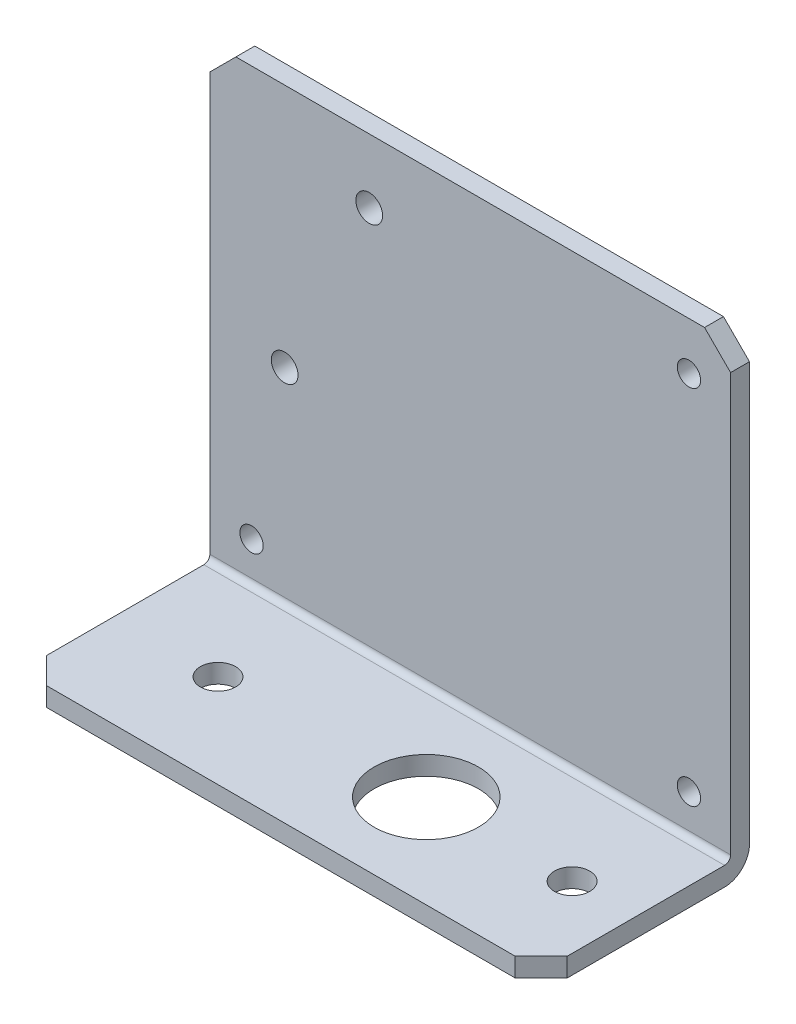
ISO-10303-21;
HEADER;
FILE_DESCRIPTION(('STEP AP214'),'2;1');
FILE_NAME('part.step','',(''),(''),'','','');
FILE_SCHEMA(('AUTOMOTIVE_DESIGN { 1 0 10303 214 1 1 1 1 }'));
ENDSEC;
DATA;
#1=APPLICATION_CONTEXT('core data for automotive mechanical design processes');
#2=APPLICATION_PROTOCOL_DEFINITION('international standard','automotive_design',2000,#1);
#3=PRODUCT_CONTEXT('',#1,'mechanical');
#4=PRODUCT('Part','Part','',(#3));
#5=PRODUCT_RELATED_PRODUCT_CATEGORY('part','',(#4));
#6=PRODUCT_DEFINITION_FORMATION('','',#4);
#7=PRODUCT_DEFINITION_CONTEXT('part definition',#1,'design');
#8=PRODUCT_DEFINITION('design','',#6,#7);
#9=PRODUCT_DEFINITION_SHAPE('','',#8);
#10=(LENGTH_UNIT() NAMED_UNIT(*) SI_UNIT(.MILLI.,.METRE.));
#11=(NAMED_UNIT(*) PLANE_ANGLE_UNIT() SI_UNIT($,.RADIAN.));
#12=(NAMED_UNIT(*) SI_UNIT($,.STERADIAN.) SOLID_ANGLE_UNIT());
#13=UNCERTAINTY_MEASURE_WITH_UNIT(LENGTH_MEASURE(1.E-05),#10,'distance_accuracy_value','');
#14=(GEOMETRIC_REPRESENTATION_CONTEXT(3) GLOBAL_UNCERTAINTY_ASSIGNED_CONTEXT((#13)) GLOBAL_UNIT_ASSIGNED_CONTEXT((#10,
#11,#12)) REPRESENTATION_CONTEXT('',''));
#15=CARTESIAN_POINT('',(0.,0.,0.));
#16=DIRECTION('',(0.,0.,1.));
#17=DIRECTION('',(1.,0.,0.));
#18=AXIS2_PLACEMENT_3D('',#15,#16,#17);
#19=CARTESIAN_POINT('',(63.5,2.30378,0.));
#20=DIRECTION('',(0.,1.,0.));
#21=DIRECTION('',(0.,0.,1.));
#22=AXIS2_PLACEMENT_3D('',#19,#20,#21);
#23=PLANE('',#22);
#24=CARTESIAN_POINT('',(38.1,2.30378,-11.38682));
#25=DIRECTION('',(0.,1.,0.));
#26=DIRECTION('',(0.,0.,1.));
#27=AXIS2_PLACEMENT_3D('',#24,#25,#26);
#28=CIRCLE('',#27,6.3627);
#29=CARTESIAN_POINT('',(38.1,2.30378,-5.02412));
#30=VERTEX_POINT('',#29);
#31=EDGE_CURVE('E144',#30,#30,#28,.F.);
#32=ORIENTED_EDGE('',*,*,#31,.T.);
#33=EDGE_LOOP('',(#32));
#34=FACE_BOUND('',#33,.T.);
#35=CARTESIAN_POINT('',(55.88,2.30378,-11.38682));
#36=DIRECTION('',(0.,1.,0.));
#37=DIRECTION('',(0.,0.,1.));
#38=AXIS2_PLACEMENT_3D('',#35,#36,#37);
#39=CIRCLE('',#38,2.15265);
#40=CARTESIAN_POINT('',(55.88,2.30378,-9.23417));
#41=VERTEX_POINT('',#40);
#42=EDGE_CURVE('E147',#41,#41,#39,.F.);
#43=ORIENTED_EDGE('',*,*,#42,.T.);
#44=EDGE_LOOP('',(#43));
#45=FACE_BOUND('',#44,.T.);
#46=CARTESIAN_POINT('',(12.7,2.30378,-11.38682));
#47=DIRECTION('',(0.,1.,0.));
#48=DIRECTION('',(0.,0.,1.));
#49=AXIS2_PLACEMENT_3D('',#46,#47,#48);
#50=CIRCLE('',#49,2.15265);
#51=CARTESIAN_POINT('',(12.7,2.30378,-9.23417));
#52=VERTEX_POINT('',#51);
#53=EDGE_CURVE('E19',#52,#52,#50,.F.);
#54=ORIENTED_EDGE('',*,*,#53,.T.);
#55=EDGE_LOOP('',(#54));
#56=FACE_BOUND('',#55,.T.);
#57=DIRECTION('',(0.,0.,-1.));
#58=VECTOR('',#57,1.);
#59=CARTESIAN_POINT('',(63.5,2.30378,-23.09622));
#60=LINE('',#59,#58);
#61=CARTESIAN_POINT('',(63.5,2.30378,-22.35962));
#62=VERTEX_POINT('',#61);
#63=CARTESIAN_POINT('',(63.5,2.30378,-3.175));
#64=VERTEX_POINT('',#63);
#65=EDGE_CURVE('E146',#62,#64,#60,.F.);
#66=ORIENTED_EDGE('',*,*,#65,.F.);
#67=DIRECTION('',(-1.,0.,0.));
#68=VECTOR('',#67,1.);
#69=CARTESIAN_POINT('',(63.5,2.30378,-22.35962));
#70=LINE('',#69,#68);
#71=CARTESIAN_POINT('',(0.,2.30378,-22.35962));
#72=VERTEX_POINT('',#71);
#73=EDGE_CURVE('E128',#62,#72,#70,.T.);
#74=ORIENTED_EDGE('',*,*,#73,.T.);
#75=DIRECTION('',(0.,0.,-1.));
#76=VECTOR('',#75,1.);
#77=CARTESIAN_POINT('',(0.,2.30378,-22.35962));
#78=LINE('',#77,#76);
#79=CARTESIAN_POINT('',(0.,2.30378,-3.175));
#80=VERTEX_POINT('',#79);
#81=EDGE_CURVE('E298',#72,#80,#78,.F.);
#82=ORIENTED_EDGE('',*,*,#81,.T.);
#83=DIRECTION('',(0.707106781186548,0.,0.707106781186548));
#84=VECTOR('',#83,1.);
#85=CARTESIAN_POINT('',(0.,2.30378,-3.175));
#86=LINE('',#85,#84);
#87=CARTESIAN_POINT('',(3.175,2.30378,0.));
#88=VERTEX_POINT('',#87);
#89=EDGE_CURVE('E174',#88,#80,#86,.F.);
#90=ORIENTED_EDGE('',*,*,#89,.F.);
#91=DIRECTION('',(1.,0.,0.));
#92=VECTOR('',#91,1.);
#93=CARTESIAN_POINT('',(63.5,2.30378,0.));
#94=LINE('',#93,#92);
#95=CARTESIAN_POINT('',(60.325,2.30378,0.));
#96=VERTEX_POINT('',#95);
#97=EDGE_CURVE('E162',#96,#88,#94,.F.);
#98=ORIENTED_EDGE('',*,*,#97,.F.);
#99=DIRECTION('',(-0.707106781186548,0.,0.707106781186548));
#100=VECTOR('',#99,1.);
#101=CARTESIAN_POINT('',(60.325,2.30378,0.));
#102=LINE('',#101,#100);
#103=EDGE_CURVE('E176',#96,#64,#102,.F.);
#104=ORIENTED_EDGE('',*,*,#103,.T.);
#105=EDGE_LOOP('',(#66,#74,#82,#90,#98,#104));
#106=FACE_BOUND('',#105,.T.);
#107=ADVANCED_FACE('F16',(#34,#45,#56,#106),#23,.T.);
#108=CARTESIAN_POINT('',(60.325,0.,0.));
#109=DIRECTION('',(-0.707106781186548,0.,-0.707106781186548));
#110=DIRECTION('',(-0.707106781186548,0.,0.707106781186548));
#111=AXIS2_PLACEMENT_3D('',#108,#109,#110);
#112=PLANE('',#111);
#113=DIRECTION('',(0.,1.,0.));
#114=VECTOR('',#113,1.);
#115=CARTESIAN_POINT('',(63.5,3.04038,-3.175));
#116=LINE('',#115,#114);
#117=CARTESIAN_POINT('',(63.5,0.,-3.175));
#118=VERTEX_POINT('',#117);
#119=EDGE_CURVE('E301',#64,#118,#116,.F.);
#120=ORIENTED_EDGE('',*,*,#119,.F.);
#121=ORIENTED_EDGE('',*,*,#103,.F.);
#122=DIRECTION('',(0.,1.,0.));
#123=VECTOR('',#122,1.);
#124=CARTESIAN_POINT('',(60.325,0.,0.));
#125=LINE('',#124,#123);
#126=CARTESIAN_POINT('',(60.325,0.,0.));
#127=VERTEX_POINT('',#126);
#128=EDGE_CURVE('E152',#127,#96,#125,.T.);
#129=ORIENTED_EDGE('',*,*,#128,.F.);
#130=DIRECTION('',(0.707106781186548,0.,-0.707106781186547));
#131=VECTOR('',#130,1.);
#132=CARTESIAN_POINT('',(60.325,0.,0.));
#133=LINE('',#132,#131);
#134=EDGE_CURVE('E289',#127,#118,#133,.T.);
#135=ORIENTED_EDGE('',*,*,#134,.T.);
#136=EDGE_LOOP('',(#120,#121,#129,#135));
#137=FACE_BOUND('',#136,.T.);
#138=ADVANCED_FACE('F319',(#137),#112,.F.);
#139=CARTESIAN_POINT('',(0.,3.04038,-3.175));
#140=DIRECTION('',(-0.707106781186548,0.,0.707106781186548));
#141=DIRECTION('',(0.707106781186548,0.,0.707106781186548));
#142=AXIS2_PLACEMENT_3D('',#139,#140,#141);
#143=PLANE('',#142);
#144=ORIENTED_EDGE('',*,*,#89,.T.);
#145=DIRECTION('',(0.,1.,0.));
#146=VECTOR('',#145,1.);
#147=CARTESIAN_POINT('',(0.,3.04038,-3.175));
#148=LINE('',#147,#146);
#149=CARTESIAN_POINT('',(0.,0.,-3.175));
#150=VERTEX_POINT('',#149);
#151=EDGE_CURVE('E297',#80,#150,#148,.F.);
#152=ORIENTED_EDGE('',*,*,#151,.T.);
#153=DIRECTION('',(0.707106781186547,0.,0.707106781186548));
#154=VECTOR('',#153,1.);
#155=CARTESIAN_POINT('',(0.,0.,-3.175));
#156=LINE('',#155,#154);
#157=CARTESIAN_POINT('',(3.175,0.,0.));
#158=VERTEX_POINT('',#157);
#159=EDGE_CURVE('E171',#150,#158,#156,.T.);
#160=ORIENTED_EDGE('',*,*,#159,.T.);
#161=DIRECTION('',(0.,1.,0.));
#162=VECTOR('',#161,1.);
#163=CARTESIAN_POINT('',(3.175,0.,0.));
#164=LINE('',#163,#162);
#165=EDGE_CURVE('E156',#88,#158,#164,.F.);
#166=ORIENTED_EDGE('',*,*,#165,.F.);
#167=EDGE_LOOP('',(#144,#152,#160,#166));
#168=FACE_BOUND('',#167,.T.);
#169=ADVANCED_FACE('F330',(#168),#143,.T.);
#170=CARTESIAN_POINT('',(63.5,0.,0.));
#171=DIRECTION('',(0.,0.,1.));
#172=DIRECTION('',(1.,0.,0.));
#173=AXIS2_PLACEMENT_3D('',#170,#171,#172);
#174=PLANE('',#173);
#175=DIRECTION('',(1.,0.,0.));
#176=VECTOR('',#175,1.);
#177=CARTESIAN_POINT('',(63.5,0.,0.));
#178=LINE('',#177,#176);
#179=EDGE_CURVE('E143',#158,#127,#178,.T.);
#180=ORIENTED_EDGE('',*,*,#179,.T.);
#181=ORIENTED_EDGE('',*,*,#128,.T.);
#182=ORIENTED_EDGE('',*,*,#97,.T.);
#183=ORIENTED_EDGE('',*,*,#165,.T.);
#184=EDGE_LOOP('',(#180,#181,#182,#183));
#185=FACE_BOUND('',#184,.T.);
#186=ADVANCED_FACE('F328',(#185),#174,.T.);
#187=CARTESIAN_POINT('',(12.7,0.,-11.38682));
#188=DIRECTION('',(0.,1.,0.));
#189=DIRECTION('',(0.,0.,1.));
#190=AXIS2_PLACEMENT_3D('',#187,#188,#189);
#191=CYLINDRICAL_SURFACE('',#190,2.15265);
#192=CARTESIAN_POINT('',(12.7,0.,-11.38682));
#193=DIRECTION('',(0.,1.,0.));
#194=DIRECTION('',(0.,0.,1.));
#195=AXIS2_PLACEMENT_3D('',#192,#193,#194);
#196=CIRCLE('',#195,2.15265);
#197=CARTESIAN_POINT('',(12.7,0.,-9.23417));
#198=VERTEX_POINT('',#197);
#199=EDGE_CURVE('E140',#198,#198,#196,.F.);
#200=ORIENTED_EDGE('',*,*,#199,.T.);
#201=EDGE_LOOP('',(#200));
#202=FACE_BOUND('',#201,.T.);
#203=ORIENTED_EDGE('',*,*,#53,.F.);
#204=EDGE_LOOP('',(#203));
#205=FACE_BOUND('',#204,.T.);
#206=ADVANCED_FACE('F495',(#202,#205),#191,.F.);
#207=CARTESIAN_POINT('',(55.88,0.,-11.38682));
#208=DIRECTION('',(0.,1.,0.));
#209=DIRECTION('',(0.,0.,1.));
#210=AXIS2_PLACEMENT_3D('',#207,#208,#209);
#211=CYLINDRICAL_SURFACE('',#210,2.15265);
#212=CARTESIAN_POINT('',(55.88,0.,-11.38682));
#213=DIRECTION('',(0.,1.,0.));
#214=DIRECTION('',(0.,0.,1.));
#215=AXIS2_PLACEMENT_3D('',#212,#213,#214);
#216=CIRCLE('',#215,2.15265);
#217=CARTESIAN_POINT('',(55.88,0.,-9.23417));
#218=VERTEX_POINT('',#217);
#219=EDGE_CURVE('E134',#218,#218,#216,.F.);
#220=ORIENTED_EDGE('',*,*,#219,.T.);
#221=EDGE_LOOP('',(#220));
#222=FACE_BOUND('',#221,.T.);
#223=ORIENTED_EDGE('',*,*,#42,.F.);
#224=EDGE_LOOP('',(#223));
#225=FACE_BOUND('',#224,.T.);
#226=ADVANCED_FACE('F486',(#222,#225),#211,.F.);
#227=CARTESIAN_POINT('',(38.1,0.,-11.38682));
#228=DIRECTION('',(0.,1.,0.));
#229=DIRECTION('',(0.,0.,1.));
#230=AXIS2_PLACEMENT_3D('',#227,#228,#229);
#231=CYLINDRICAL_SURFACE('',#230,6.3627);
#232=CARTESIAN_POINT('',(38.1,0.,-11.38682));
#233=DIRECTION('',(0.,1.,0.));
#234=DIRECTION('',(0.,0.,1.));
#235=AXIS2_PLACEMENT_3D('',#232,#233,#234);
#236=CIRCLE('',#235,6.3627);
#237=CARTESIAN_POINT('',(38.1,0.,-5.02412));
#238=VERTEX_POINT('',#237);
#239=EDGE_CURVE('E130',#238,#238,#236,.F.);
#240=ORIENTED_EDGE('',*,*,#239,.T.);
#241=EDGE_LOOP('',(#240));
#242=FACE_BOUND('',#241,.T.);
#243=ORIENTED_EDGE('',*,*,#31,.F.);
#244=EDGE_LOOP('',(#243));
#245=FACE_BOUND('',#244,.T.);
#246=ADVANCED_FACE('F478',(#242,#245),#231,.F.);
#247=CARTESIAN_POINT('',(63.5,3.04038,-22.35962));
#248=DIRECTION('',(-1.,0.,0.));
#249=DIRECTION('',(0.,0.,1.));
#250=AXIS2_PLACEMENT_3D('',#247,#248,#249);
#251=CYLINDRICAL_SURFACE('',#250,0.7366);
#252=ORIENTED_EDGE('',*,*,#73,.F.);
#253=CARTESIAN_POINT('',(63.5,3.04038,-22.35962));
#254=DIRECTION('',(-1.,0.,0.));
#255=DIRECTION('',(0.,0.,1.));
#256=AXIS2_PLACEMENT_3D('',#253,#254,#255);
#257=CIRCLE('',#256,0.7366);
#258=CARTESIAN_POINT('',(63.5,3.04038,-23.09622));
#259=VERTEX_POINT('',#258);
#260=EDGE_CURVE('E120',#259,#62,#257,.T.);
#261=ORIENTED_EDGE('',*,*,#260,.F.);
#262=DIRECTION('',(1.,0.,0.));
#263=VECTOR('',#262,1.);
#264=CARTESIAN_POINT('',(63.5,3.04038,-23.09622));
#265=LINE('',#264,#263);
#266=CARTESIAN_POINT('',(0.,3.04038,-23.09622));
#267=VERTEX_POINT('',#266);
#268=EDGE_CURVE('E102',#267,#259,#265,.T.);
#269=ORIENTED_EDGE('',*,*,#268,.F.);
#270=CARTESIAN_POINT('',(0.,3.04038,-22.35962));
#271=DIRECTION('',(-1.,0.,0.));
#272=DIRECTION('',(0.,0.,1.));
#273=AXIS2_PLACEMENT_3D('',#270,#271,#272);
#274=CIRCLE('',#273,0.7366);
#275=EDGE_CURVE('E114',#72,#267,#274,.F.);
#276=ORIENTED_EDGE('',*,*,#275,.F.);
#277=EDGE_LOOP('',(#252,#261,#269,#276));
#278=FACE_BOUND('',#277,.T.);
#279=ADVANCED_FACE('F126',(#278),#251,.F.);
#280=CARTESIAN_POINT('',(63.5,0.,0.));
#281=DIRECTION('',(0.,1.,0.));
#282=DIRECTION('',(0.,0.,1.));
#283=AXIS2_PLACEMENT_3D('',#280,#281,#282);
#284=PLANE('',#283);
#285=ORIENTED_EDGE('',*,*,#239,.F.);
#286=EDGE_LOOP('',(#285));
#287=FACE_BOUND('',#286,.T.);
#288=ORIENTED_EDGE('',*,*,#219,.F.);
#289=EDGE_LOOP('',(#288));
#290=FACE_BOUND('',#289,.T.);
#291=ORIENTED_EDGE('',*,*,#199,.F.);
#292=EDGE_LOOP('',(#291));
#293=FACE_BOUND('',#292,.T.);
#294=ORIENTED_EDGE('',*,*,#159,.F.);
#295=DIRECTION('',(0.,0.,1.));
#296=VECTOR('',#295,1.);
#297=CARTESIAN_POINT('',(0.,0.,0.));
#298=LINE('',#297,#296);
#299=CARTESIAN_POINT('',(0.,0.,-22.35962));
#300=VERTEX_POINT('',#299);
#301=EDGE_CURVE('E288',#300,#150,#298,.T.);
#302=ORIENTED_EDGE('',*,*,#301,.F.);
#303=DIRECTION('',(-1.,0.,0.));
#304=VECTOR('',#303,1.);
#305=CARTESIAN_POINT('',(63.5,0.,-22.35962));
#306=LINE('',#305,#304);
#307=CARTESIAN_POINT('',(63.5,0.,-22.35962));
#308=VERTEX_POINT('',#307);
#309=EDGE_CURVE('E123',#308,#300,#306,.T.);
#310=ORIENTED_EDGE('',*,*,#309,.F.);
#311=DIRECTION('',(0.,0.,1.));
#312=VECTOR('',#311,1.);
#313=CARTESIAN_POINT('',(63.5,0.,0.));
#314=LINE('',#313,#312);
#315=EDGE_CURVE('E285',#118,#308,#314,.F.);
#316=ORIENTED_EDGE('',*,*,#315,.F.);
#317=ORIENTED_EDGE('',*,*,#134,.F.);
#318=ORIENTED_EDGE('',*,*,#179,.F.);
#319=EDGE_LOOP('',(#294,#302,#310,#316,#317,#318));
#320=FACE_BOUND('',#319,.T.);
#321=ADVANCED_FACE('F324',(#287,#290,#293,#320),#284,.F.);
#322=CARTESIAN_POINT('',(63.5,0.,-23.09622));
#323=DIRECTION('',(0.,0.,1.));
#324=DIRECTION('',(1.,0.,0.));
#325=AXIS2_PLACEMENT_3D('',#322,#323,#324);
#326=PLANE('',#325);
#327=CARTESIAN_POINT('',(5.08,7.17358015264844,-23.09622));
#328=DIRECTION('',(0.,0.,1.));
#329=DIRECTION('',(1.,0.,0.));
#330=AXIS2_PLACEMENT_3D('',#327,#328,#329);
#331=CIRCLE('',#330,1.4224);
#332=CARTESIAN_POINT('',(6.5024,7.17358015264844,-23.09622));
#333=VERTEX_POINT('',#332);
#334=EDGE_CURVE('E200',#333,#333,#331,.F.);
#335=ORIENTED_EDGE('',*,*,#334,.T.);
#336=EDGE_LOOP('',(#335));
#337=FACE_BOUND('',#336,.T.);
#338=CARTESIAN_POINT('',(58.42,7.17358015264844,-23.09622));
#339=DIRECTION('',(0.,0.,1.));
#340=DIRECTION('',(1.,0.,0.));
#341=AXIS2_PLACEMENT_3D('',#338,#339,#340);
#342=CIRCLE('',#341,1.4224);
#343=CARTESIAN_POINT('',(59.8424,7.17358015264844,-23.09622));
#344=VERTEX_POINT('',#343);
#345=EDGE_CURVE('E204',#344,#344,#342,.F.);
#346=ORIENTED_EDGE('',*,*,#345,.T.);
#347=EDGE_LOOP('',(#346));
#348=FACE_BOUND('',#347,.T.);
#349=CARTESIAN_POINT('',(58.42,51.3318075527912,-23.09622));
#350=DIRECTION('',(0.,0.,1.));
#351=DIRECTION('',(1.,0.,0.));
#352=AXIS2_PLACEMENT_3D('',#349,#350,#351);
#353=CIRCLE('',#352,1.4224);
#354=CARTESIAN_POINT('',(59.8424,51.3318075527912,-23.09622));
#355=VERTEX_POINT('',#354);
#356=EDGE_CURVE('E207',#355,#355,#353,.F.);
#357=ORIENTED_EDGE('',*,*,#356,.T.);
#358=EDGE_LOOP('',(#357));
#359=FACE_BOUND('',#358,.T.);
#360=CARTESIAN_POINT('',(19.431,49.3268,-23.09622));
#361=DIRECTION('',(0.,0.,1.));
#362=DIRECTION('',(1.,0.,0.));
#363=AXIS2_PLACEMENT_3D('',#360,#361,#362);
#364=CIRCLE('',#363,1.63195);
#365=CARTESIAN_POINT('',(21.06295,49.3268,-23.09622));
#366=VERTEX_POINT('',#365);
#367=EDGE_CURVE('E210',#366,#366,#364,.F.);
#368=ORIENTED_EDGE('',*,*,#367,.T.);
#369=EDGE_LOOP('',(#368));
#370=FACE_BOUND('',#369,.T.);
#371=CARTESIAN_POINT('',(9.1186,27.32786,-23.09622));
#372=DIRECTION('',(0.,0.,1.));
#373=DIRECTION('',(1.,0.,0.));
#374=AXIS2_PLACEMENT_3D('',#371,#372,#373);
#375=CIRCLE('',#374,1.63195);
#376=CARTESIAN_POINT('',(10.75055,27.32786,-23.09622));
#377=VERTEX_POINT('',#376);
#378=EDGE_CURVE('E213',#377,#377,#375,.F.);
#379=ORIENTED_EDGE('',*,*,#378,.T.);
#380=EDGE_LOOP('',(#379));
#381=FACE_BOUND('',#380,.T.);
#382=DIRECTION('',(0.,1.,0.));
#383=VECTOR('',#382,1.);
#384=CARTESIAN_POINT('',(63.5,3.04038,-23.09622));
#385=LINE('',#384,#383);
#386=CARTESIAN_POINT('',(63.4999999999999,53.9749999999999,-23.09622));
#387=VERTEX_POINT('',#386);
#388=EDGE_CURVE('E106',#387,#259,#385,.F.);
#389=ORIENTED_EDGE('',*,*,#388,.F.);
#390=DIRECTION('',(0.707106781186498,-0.707106781186598,0.));
#391=VECTOR('',#390,1.);
#392=CARTESIAN_POINT('',(60.325,57.15,-23.09622));
#393=LINE('',#392,#391);
#394=CARTESIAN_POINT('',(60.325,57.15,-23.09622));
#395=VERTEX_POINT('',#394);
#396=EDGE_CURVE('E257',#387,#395,#393,.F.);
#397=ORIENTED_EDGE('',*,*,#396,.T.);
#398=DIRECTION('',(1.,0.,0.));
#399=VECTOR('',#398,1.);
#400=CARTESIAN_POINT('',(63.5,57.15,-23.09622));
#401=LINE('',#400,#399);
#402=CARTESIAN_POINT('',(3.17500000000015,57.1499999999998,-23.09622));
#403=VERTEX_POINT('',#402);
#404=EDGE_CURVE('E255',#403,#395,#401,.T.);
#405=ORIENTED_EDGE('',*,*,#404,.F.);
#406=DIRECTION('',(0.707106781186598,0.707106781186498,0.));
#407=VECTOR('',#406,1.);
#408=CARTESIAN_POINT('',(0.,53.975,-23.09622));
#409=LINE('',#408,#407);
#410=CARTESIAN_POINT('',(0.,53.975,-23.09622));
#411=VERTEX_POINT('',#410);
#412=EDGE_CURVE('E240',#403,#411,#409,.F.);
#413=ORIENTED_EDGE('',*,*,#412,.T.);
#414=DIRECTION('',(0.,1.,0.));
#415=VECTOR('',#414,1.);
#416=CARTESIAN_POINT('',(0.,2.30378,-23.09622));
#417=LINE('',#416,#415);
#418=EDGE_CURVE('E109',#267,#411,#417,.T.);
#419=ORIENTED_EDGE('',*,*,#418,.F.);
#420=ORIENTED_EDGE('',*,*,#268,.T.);
#421=EDGE_LOOP('',(#389,#397,#405,#413,#419,#420));
#422=FACE_BOUND('',#421,.T.);
#423=ADVANCED_FACE('F104',(#337,#348,#359,#370,#381,#422),#326,.T.);
#424=CARTESIAN_POINT('',(63.5,3.04038,-22.35962));
#425=DIRECTION('',(-1.,0.,0.));
#426=DIRECTION('',(0.,0.,1.));
#427=AXIS2_PLACEMENT_3D('',#424,#425,#426);
#428=CYLINDRICAL_SURFACE('',#427,3.04038);
#429=CARTESIAN_POINT('',(63.5,3.04038,-22.35962));
#430=DIRECTION('',(-1.,0.,0.));
#431=DIRECTION('',(0.,0.,1.));
#432=AXIS2_PLACEMENT_3D('',#429,#430,#431);
#433=CIRCLE('',#432,3.04038);
#434=CARTESIAN_POINT('',(63.5,3.04038,-25.4));
#435=VERTEX_POINT('',#434);
#436=EDGE_CURVE('E216',#435,#308,#433,.T.);
#437=ORIENTED_EDGE('',*,*,#436,.T.);
#438=ORIENTED_EDGE('',*,*,#309,.T.);
#439=CARTESIAN_POINT('',(0.,3.04038,-22.35962));
#440=DIRECTION('',(-1.,0.,0.));
#441=DIRECTION('',(0.,0.,1.));
#442=AXIS2_PLACEMENT_3D('',#439,#440,#441);
#443=CIRCLE('',#442,3.04038);
#444=CARTESIAN_POINT('',(0.,3.04038,-25.4));
#445=VERTEX_POINT('',#444);
#446=EDGE_CURVE('E113',#300,#445,#443,.F.);
#447=ORIENTED_EDGE('',*,*,#446,.T.);
#448=DIRECTION('',(1.,0.,0.));
#449=VECTOR('',#448,1.);
#450=CARTESIAN_POINT('',(63.5,3.04038,-25.4));
#451=LINE('',#450,#449);
#452=EDGE_CURVE('E203',#445,#435,#451,.T.);
#453=ORIENTED_EDGE('',*,*,#452,.T.);
#454=EDGE_LOOP('',(#437,#438,#447,#453));
#455=FACE_BOUND('',#454,.T.);
#456=ADVANCED_FACE('F222',(#455),#428,.T.);
#457=CARTESIAN_POINT('',(63.5,3.04038,-22.35962));
#458=DIRECTION('',(1.,0.,0.));
#459=DIRECTION('',(0.,0.,-1.));
#460=AXIS2_PLACEMENT_3D('',#457,#458,#459);
#461=PLANE('',#460);
#462=ORIENTED_EDGE('',*,*,#388,.T.);
#463=ORIENTED_EDGE('',*,*,#260,.T.);
#464=ORIENTED_EDGE('',*,*,#65,.T.);
#465=ORIENTED_EDGE('',*,*,#119,.T.);
#466=ORIENTED_EDGE('',*,*,#315,.T.);
#467=ORIENTED_EDGE('',*,*,#436,.F.);
#468=DIRECTION('',(0.,1.,0.));
#469=VECTOR('',#468,1.);
#470=CARTESIAN_POINT('',(63.5,0.,-25.4));
#471=LINE('',#470,#469);
#472=CARTESIAN_POINT('',(63.4999999999998,53.9749999999998,-25.4));
#473=VERTEX_POINT('',#472);
#474=EDGE_CURVE('E231',#435,#473,#471,.T.);
#475=ORIENTED_EDGE('',*,*,#474,.T.);
#476=DIRECTION('',(0.,0.,1.));
#477=VECTOR('',#476,1.);
#478=CARTESIAN_POINT('',(63.4999999999998,53.9749999999998,-23.09622));
#479=LINE('',#478,#477);
#480=EDGE_CURVE('E122',#473,#387,#479,.T.);
#481=ORIENTED_EDGE('',*,*,#480,.T.);
#482=EDGE_LOOP('',(#462,#463,#464,#465,#466,#467,#475,#481));
#483=FACE_BOUND('',#482,.T.);
#484=ADVANCED_FACE('F119',(#483),#461,.T.);
#485=CARTESIAN_POINT('',(60.325,57.15,-23.09622));
#486=DIRECTION('',(-0.707106781186598,-0.707106781186498,0.));
#487=DIRECTION('',(0.707106781186498,-0.707106781186598,0.));
#488=AXIS2_PLACEMENT_3D('',#485,#486,#487);
#489=PLANE('',#488);
#490=ORIENTED_EDGE('',*,*,#480,.F.);
#491=DIRECTION('',(-0.707106781186547,0.707106781186547,0.));
#492=VECTOR('',#491,1.);
#493=CARTESIAN_POINT('',(63.5,53.975,-25.4));
#494=LINE('',#493,#492);
#495=CARTESIAN_POINT('',(60.325,57.15,-25.4));
#496=VERTEX_POINT('',#495);
#497=EDGE_CURVE('E264',#473,#496,#494,.T.);
#498=ORIENTED_EDGE('',*,*,#497,.T.);
#499=DIRECTION('',(0.,0.,1.));
#500=VECTOR('',#499,1.);
#501=CARTESIAN_POINT('',(60.325,57.15,-23.09622));
#502=LINE('',#501,#500);
#503=EDGE_CURVE('E252',#395,#496,#502,.F.);
#504=ORIENTED_EDGE('',*,*,#503,.F.);
#505=ORIENTED_EDGE('',*,*,#396,.F.);
#506=EDGE_LOOP('',(#490,#498,#504,#505));
#507=FACE_BOUND('',#506,.T.);
#508=ADVANCED_FACE('F340',(#507),#489,.F.);
#509=CARTESIAN_POINT('',(63.5,57.15,-23.09622));
#510=DIRECTION('',(0.,1.,0.));
#511=DIRECTION('',(0.,0.,1.));
#512=AXIS2_PLACEMENT_3D('',#509,#510,#511);
#513=PLANE('',#512);
#514=ORIENTED_EDGE('',*,*,#404,.T.);
#515=ORIENTED_EDGE('',*,*,#503,.T.);
#516=DIRECTION('',(1.,0.,0.));
#517=VECTOR('',#516,1.);
#518=CARTESIAN_POINT('',(63.5,57.15,-25.4));
#519=LINE('',#518,#517);
#520=CARTESIAN_POINT('',(3.17500000000023,57.1499999999998,-25.4));
#521=VERTEX_POINT('',#520);
#522=EDGE_CURVE('E236',#496,#521,#519,.F.);
#523=ORIENTED_EDGE('',*,*,#522,.T.);
#524=DIRECTION('',(0.,0.,1.));
#525=VECTOR('',#524,1.);
#526=CARTESIAN_POINT('',(3.17500000000023,57.1499999999998,-22.35962));
#527=LINE('',#526,#525);
#528=EDGE_CURVE('E244',#521,#403,#527,.T.);
#529=ORIENTED_EDGE('',*,*,#528,.T.);
#530=EDGE_LOOP('',(#514,#515,#523,#529));
#531=FACE_BOUND('',#530,.T.);
#532=ADVANCED_FACE('F337',(#531),#513,.T.);
#533=CARTESIAN_POINT('',(0.,53.975,-22.35962));
#534=DIRECTION('',(0.707106781186498,-0.707106781186598,0.));
#535=DIRECTION('',(0.707106781186598,0.707106781186498,0.));
#536=AXIS2_PLACEMENT_3D('',#533,#534,#535);
#537=PLANE('',#536);
#538=ORIENTED_EDGE('',*,*,#528,.F.);
#539=DIRECTION('',(-0.707106781186547,-0.707106781186548,0.));
#540=VECTOR('',#539,1.);
#541=CARTESIAN_POINT('',(3.175,57.15,-25.4));
#542=LINE('',#541,#540);
#543=CARTESIAN_POINT('',(0.,53.975,-25.4));
#544=VERTEX_POINT('',#543);
#545=EDGE_CURVE('E234',#521,#544,#542,.T.);
#546=ORIENTED_EDGE('',*,*,#545,.T.);
#547=DIRECTION('',(0.,0.,1.));
#548=VECTOR('',#547,1.);
#549=CARTESIAN_POINT('',(0.,53.975,-22.35962));
#550=LINE('',#549,#548);
#551=EDGE_CURVE('E34',#411,#544,#550,.F.);
#552=ORIENTED_EDGE('',*,*,#551,.F.);
#553=ORIENTED_EDGE('',*,*,#412,.F.);
#554=EDGE_LOOP('',(#538,#546,#552,#553));
#555=FACE_BOUND('',#554,.T.);
#556=ADVANCED_FACE('F334',(#555),#537,.F.);
#557=CARTESIAN_POINT('',(0.,2.30378,-22.35962));
#558=DIRECTION('',(-1.,0.,0.));
#559=DIRECTION('',(0.,0.,1.));
#560=AXIS2_PLACEMENT_3D('',#557,#558,#559);
#561=PLANE('',#560);
#562=DIRECTION('',(0.,1.,0.));
#563=VECTOR('',#562,1.);
#564=CARTESIAN_POINT('',(0.,0.,-25.4));
#565=LINE('',#564,#563);
#566=EDGE_CURVE('E199',#544,#445,#565,.F.);
#567=ORIENTED_EDGE('',*,*,#566,.T.);
#568=ORIENTED_EDGE('',*,*,#446,.F.);
#569=ORIENTED_EDGE('',*,*,#301,.T.);
#570=ORIENTED_EDGE('',*,*,#151,.F.);
#571=ORIENTED_EDGE('',*,*,#81,.F.);
#572=ORIENTED_EDGE('',*,*,#275,.T.);
#573=ORIENTED_EDGE('',*,*,#418,.T.);
#574=ORIENTED_EDGE('',*,*,#551,.T.);
#575=EDGE_LOOP('',(#567,#568,#569,#570,#571,#572,#573,#574));
#576=FACE_BOUND('',#575,.T.);
#577=ADVANCED_FACE('F233',(#576),#561,.T.);
#578=CARTESIAN_POINT('',(9.1186,27.32786,-25.4));
#579=DIRECTION('',(0.,0.,1.));
#580=DIRECTION('',(1.,0.,0.));
#581=AXIS2_PLACEMENT_3D('',#578,#579,#580);
#582=CYLINDRICAL_SURFACE('',#581,1.63195);
#583=CARTESIAN_POINT('',(9.1186,27.32786,-25.4));
#584=DIRECTION('',(0.,0.,1.));
#585=DIRECTION('',(1.,0.,0.));
#586=AXIS2_PLACEMENT_3D('',#583,#584,#585);
#587=CIRCLE('',#586,1.63195);
#588=CARTESIAN_POINT('',(10.75055,27.32786,-25.4));
#589=VERTEX_POINT('',#588);
#590=EDGE_CURVE('E196',#589,#589,#587,.F.);
#591=ORIENTED_EDGE('',*,*,#590,.T.);
#592=EDGE_LOOP('',(#591));
#593=FACE_BOUND('',#592,.T.);
#594=ORIENTED_EDGE('',*,*,#378,.F.);
#595=EDGE_LOOP('',(#594));
#596=FACE_BOUND('',#595,.T.);
#597=ADVANCED_FACE('F373',(#593,#596),#582,.F.);
#598=CARTESIAN_POINT('',(19.431,49.3268,-25.4));
#599=DIRECTION('',(0.,0.,1.));
#600=DIRECTION('',(1.,0.,0.));
#601=AXIS2_PLACEMENT_3D('',#598,#599,#600);
#602=CYLINDRICAL_SURFACE('',#601,1.63195);
#603=CARTESIAN_POINT('',(19.431,49.3268,-25.4));
#604=DIRECTION('',(0.,0.,1.));
#605=DIRECTION('',(1.,0.,0.));
#606=AXIS2_PLACEMENT_3D('',#603,#604,#605);
#607=CIRCLE('',#606,1.63195);
#608=CARTESIAN_POINT('',(21.06295,49.3268,-25.4));
#609=VERTEX_POINT('',#608);
#610=EDGE_CURVE('E193',#609,#609,#607,.F.);
#611=ORIENTED_EDGE('',*,*,#610,.T.);
#612=EDGE_LOOP('',(#611));
#613=FACE_BOUND('',#612,.T.);
#614=ORIENTED_EDGE('',*,*,#367,.F.);
#615=EDGE_LOOP('',(#614));
#616=FACE_BOUND('',#615,.T.);
#617=ADVANCED_FACE('F369',(#613,#616),#602,.F.);
#618=CARTESIAN_POINT('',(58.42,51.3318075527912,-23.09622));
#619=DIRECTION('',(0.,0.,1.));
#620=DIRECTION('',(1.,0.,0.));
#621=AXIS2_PLACEMENT_3D('',#618,#619,#620);
#622=CYLINDRICAL_SURFACE('',#621,1.4224);
#623=ORIENTED_EDGE('',*,*,#356,.F.);
#624=EDGE_LOOP('',(#623));
#625=FACE_BOUND('',#624,.T.);
#626=CARTESIAN_POINT('',(58.42,51.3318075527912,-25.4));
#627=DIRECTION('',(0.,0.,1.));
#628=DIRECTION('',(1.,0.,0.));
#629=AXIS2_PLACEMENT_3D('',#626,#627,#628);
#630=CIRCLE('',#629,1.4224);
#631=CARTESIAN_POINT('',(59.8424,51.3318075527912,-25.4));
#632=VERTEX_POINT('',#631);
#633=EDGE_CURVE('E190',#632,#632,#630,.F.);
#634=ORIENTED_EDGE('',*,*,#633,.T.);
#635=EDGE_LOOP('',(#634));
#636=FACE_BOUND('',#635,.T.);
#637=ADVANCED_FACE('F365',(#625,#636),#622,.F.);
#638=CARTESIAN_POINT('',(58.42,7.17358015264844,-23.09622));
#639=DIRECTION('',(0.,0.,1.));
#640=DIRECTION('',(1.,0.,0.));
#641=AXIS2_PLACEMENT_3D('',#638,#639,#640);
#642=CYLINDRICAL_SURFACE('',#641,1.4224);
#643=ORIENTED_EDGE('',*,*,#345,.F.);
#644=EDGE_LOOP('',(#643));
#645=FACE_BOUND('',#644,.T.);
#646=CARTESIAN_POINT('',(58.42,7.17358015264844,-25.4));
#647=DIRECTION('',(0.,0.,1.));
#648=DIRECTION('',(1.,0.,0.));
#649=AXIS2_PLACEMENT_3D('',#646,#647,#648);
#650=CIRCLE('',#649,1.4224);
#651=CARTESIAN_POINT('',(59.8424,7.17358015264844,-25.4));
#652=VERTEX_POINT('',#651);
#653=EDGE_CURVE('E25',#652,#652,#650,.F.);
#654=ORIENTED_EDGE('',*,*,#653,.T.);
#655=EDGE_LOOP('',(#654));
#656=FACE_BOUND('',#655,.T.);
#657=ADVANCED_FACE('F357',(#645,#656),#642,.F.);
#658=CARTESIAN_POINT('',(5.08,7.17358015264844,-23.09622));
#659=DIRECTION('',(0.,0.,1.));
#660=DIRECTION('',(1.,0.,0.));
#661=AXIS2_PLACEMENT_3D('',#658,#659,#660);
#662=CYLINDRICAL_SURFACE('',#661,1.4224);
#663=ORIENTED_EDGE('',*,*,#334,.F.);
#664=EDGE_LOOP('',(#663));
#665=FACE_BOUND('',#664,.T.);
#666=CARTESIAN_POINT('',(5.08,7.17358015264844,-25.4));
#667=DIRECTION('',(0.,0.,1.));
#668=DIRECTION('',(1.,0.,0.));
#669=AXIS2_PLACEMENT_3D('',#666,#667,#668);
#670=CIRCLE('',#669,1.4224);
#671=CARTESIAN_POINT('',(6.5024,7.17358015264844,-25.4));
#672=VERTEX_POINT('',#671);
#673=EDGE_CURVE('E11',#672,#672,#670,.F.);
#674=ORIENTED_EDGE('',*,*,#673,.T.);
#675=EDGE_LOOP('',(#674));
#676=FACE_BOUND('',#675,.T.);
#677=ADVANCED_FACE('F351',(#665,#676),#662,.F.);
#678=CARTESIAN_POINT('',(63.5,0.,-25.4));
#679=DIRECTION('',(0.,0.,1.));
#680=DIRECTION('',(1.,0.,0.));
#681=AXIS2_PLACEMENT_3D('',#678,#679,#680);
#682=PLANE('',#681);
#683=ORIENTED_EDGE('',*,*,#673,.F.);
#684=EDGE_LOOP('',(#683));
#685=FACE_BOUND('',#684,.T.);
#686=ORIENTED_EDGE('',*,*,#653,.F.);
#687=EDGE_LOOP('',(#686));
#688=FACE_BOUND('',#687,.T.);
#689=ORIENTED_EDGE('',*,*,#633,.F.);
#690=EDGE_LOOP('',(#689));
#691=FACE_BOUND('',#690,.T.);
#692=ORIENTED_EDGE('',*,*,#610,.F.);
#693=EDGE_LOOP('',(#692));
#694=FACE_BOUND('',#693,.T.);
#695=ORIENTED_EDGE('',*,*,#590,.F.);
#696=EDGE_LOOP('',(#695));
#697=FACE_BOUND('',#696,.T.);
#698=ORIENTED_EDGE('',*,*,#545,.F.);
#699=ORIENTED_EDGE('',*,*,#522,.F.);
#700=ORIENTED_EDGE('',*,*,#497,.F.);
#701=ORIENTED_EDGE('',*,*,#474,.F.);
#702=ORIENTED_EDGE('',*,*,#452,.F.);
#703=ORIENTED_EDGE('',*,*,#566,.F.);
#704=EDGE_LOOP('',(#698,#699,#700,#701,#702,#703));
#705=FACE_BOUND('',#704,.T.);
#706=ADVANCED_FACE('F228',(#685,#688,#691,#694,#697,#705),#682,.F.);
#707=CLOSED_SHELL('',(#107,#138,#169,#186,#206,#226,#246,#279,#321,#423,#456,#484,#508,#532,
#556,#577,#597,#617,#637,#657,#677,#706));
#708=MANIFOLD_SOLID_BREP('B1',#707);
#709=ADVANCED_BREP_SHAPE_REPRESENTATION('',(#18,#708),#14);
#710=SHAPE_DEFINITION_REPRESENTATION(#9,#709);
ENDSEC;
END-ISO-10303-21;
